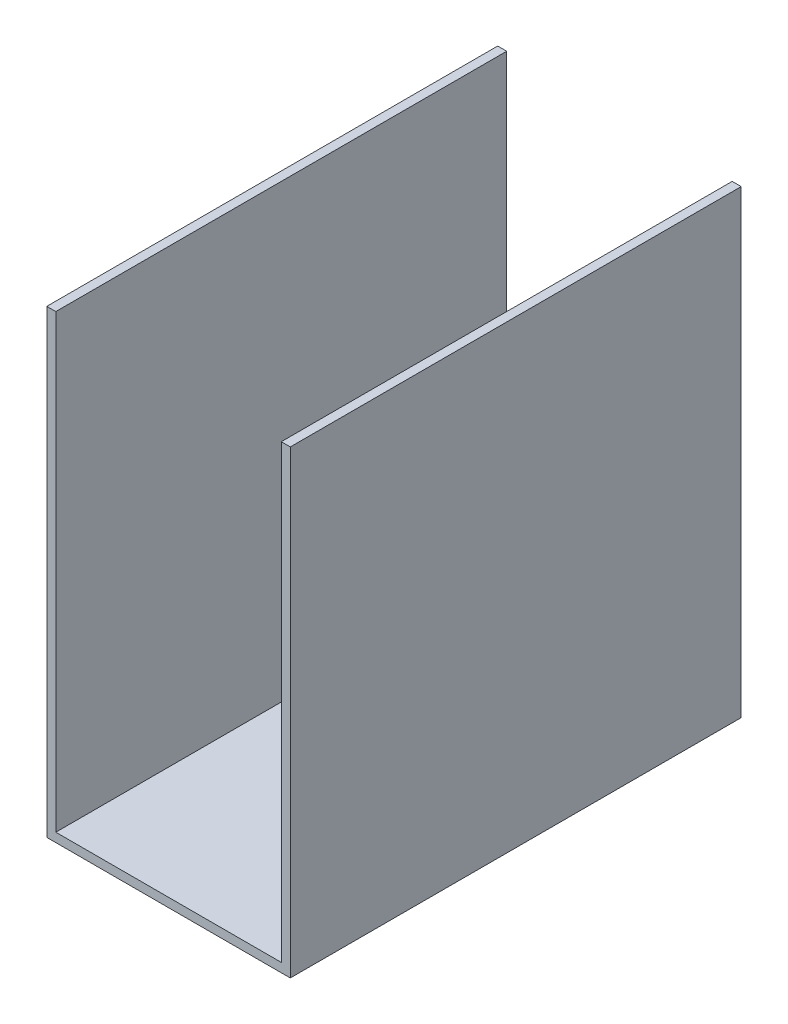
ISO-10303-21;
HEADER;
FILE_DESCRIPTION(('STEP AP214'),'2;1');
FILE_NAME('part.step','',(''),(''),'','','');
FILE_SCHEMA(('AUTOMOTIVE_DESIGN { 1 0 10303 214 1 1 1 1 }'));
ENDSEC;
DATA;
#1=APPLICATION_CONTEXT('core data for automotive mechanical design processes');
#2=APPLICATION_PROTOCOL_DEFINITION('international standard','automotive_design',2000,#1);
#3=PRODUCT_CONTEXT('',#1,'mechanical');
#4=PRODUCT('Part','Part','',(#3));
#5=PRODUCT_RELATED_PRODUCT_CATEGORY('part','',(#4));
#6=PRODUCT_DEFINITION_FORMATION('','',#4);
#7=PRODUCT_DEFINITION_CONTEXT('part definition',#1,'design');
#8=PRODUCT_DEFINITION('design','',#6,#7);
#9=PRODUCT_DEFINITION_SHAPE('','',#8);
#10=(LENGTH_UNIT() NAMED_UNIT(*) SI_UNIT(.MILLI.,.METRE.));
#11=(NAMED_UNIT(*) PLANE_ANGLE_UNIT() SI_UNIT($,.RADIAN.));
#12=(NAMED_UNIT(*) SI_UNIT($,.STERADIAN.) SOLID_ANGLE_UNIT());
#13=UNCERTAINTY_MEASURE_WITH_UNIT(LENGTH_MEASURE(1.E-05),#10,'distance_accuracy_value','');
#14=(GEOMETRIC_REPRESENTATION_CONTEXT(3) GLOBAL_UNCERTAINTY_ASSIGNED_CONTEXT((#13)) GLOBAL_UNIT_ASSIGNED_CONTEXT((#10,
#11,#12)) REPRESENTATION_CONTEXT('',''));
#15=CARTESIAN_POINT('',(0.,0.,0.));
#16=DIRECTION('',(0.,0.,1.));
#17=DIRECTION('',(1.,0.,0.));
#18=AXIS2_PLACEMENT_3D('',#15,#16,#17);
#19=CARTESIAN_POINT('',(-200.,0.,-10000.));
#20=DIRECTION('',(0.,1.,0.));
#21=DIRECTION('',(0.,0.,1.));
#22=AXIS2_PLACEMENT_3D('',#19,#20,#21);
#23=PLANE('',#22);
#24=DIRECTION('',(-1.,0.,0.));
#25=VECTOR('',#24,1.);
#26=CARTESIAN_POINT('',(-200.,0.,0.));
#27=LINE('',#26,#25);
#28=CARTESIAN_POINT('',(0.,0.,0.));
#29=VERTEX_POINT('',#28);
#30=CARTESIAN_POINT('',(-200.,0.,0.));
#31=VERTEX_POINT('',#30);
#32=EDGE_CURVE('E146',#29,#31,#27,.T.);
#33=ORIENTED_EDGE('',*,*,#32,.F.);
#34=DIRECTION('',(0.,0.,1.));
#35=VECTOR('',#34,1.);
#36=CARTESIAN_POINT('',(0.,0.,-10000.));
#37=LINE('',#36,#35);
#38=CARTESIAN_POINT('',(0.,0.,-10000.));
#39=VERTEX_POINT('',#38);
#40=EDGE_CURVE('E11',#39,#29,#37,.T.);
#41=ORIENTED_EDGE('',*,*,#40,.F.);
#42=DIRECTION('',(-1.,0.,0.));
#43=VECTOR('',#42,1.);
#44=CARTESIAN_POINT('',(-200.,0.,-10000.));
#45=LINE('',#44,#43);
#46=CARTESIAN_POINT('',(-200.,0.,-10000.));
#47=VERTEX_POINT('',#46);
#48=EDGE_CURVE('E174',#39,#47,#45,.T.);
#49=ORIENTED_EDGE('',*,*,#48,.T.);
#50=DIRECTION('',(0.,0.,1.));
#51=VECTOR('',#50,1.);
#52=CARTESIAN_POINT('',(-200.,0.,-10000.));
#53=LINE('',#52,#51);
#54=EDGE_CURVE('E46',#47,#31,#53,.T.);
#55=ORIENTED_EDGE('',*,*,#54,.T.);
#56=EDGE_LOOP('',(#33,#41,#49,#55));
#57=FACE_BOUND('',#56,.T.);
#58=ADVANCED_FACE('F43',(#57),#23,.T.);
#59=CARTESIAN_POINT('',(0.,0.,-10000.));
#60=DIRECTION('',(1.,0.,0.));
#61=DIRECTION('',(0.,1.,0.));
#62=AXIS2_PLACEMENT_3D('',#59,#60,#61);
#63=PLANE('',#62);
#64=DIRECTION('',(0.,1.,0.));
#65=VECTOR('',#64,1.);
#66=CARTESIAN_POINT('',(0.,0.,0.));
#67=LINE('',#66,#65);
#68=CARTESIAN_POINT('',(1.22464679914735E-12,-10000.,0.));
#69=VERTEX_POINT('',#68);
#70=EDGE_CURVE('E171',#69,#29,#67,.T.);
#71=ORIENTED_EDGE('',*,*,#70,.F.);
#72=DIRECTION('',(0.,0.,1.));
#73=VECTOR('',#72,1.);
#74=CARTESIAN_POINT('',(1.22464679914735E-12,-10000.,-10000.));
#75=LINE('',#74,#73);
#76=CARTESIAN_POINT('',(1.22464679914735E-12,-10000.,-10000.));
#77=VERTEX_POINT('',#76);
#78=EDGE_CURVE('E53',#77,#69,#75,.T.);
#79=ORIENTED_EDGE('',*,*,#78,.F.);
#80=DIRECTION('',(0.,1.,0.));
#81=VECTOR('',#80,1.);
#82=CARTESIAN_POINT('',(0.,0.,-10000.));
#83=LINE('',#82,#81);
#84=EDGE_CURVE('E132',#77,#39,#83,.T.);
#85=ORIENTED_EDGE('',*,*,#84,.T.);
#86=ORIENTED_EDGE('',*,*,#40,.T.);
#87=EDGE_LOOP('',(#71,#79,#85,#86));
#88=FACE_BOUND('',#87,.T.);
#89=ADVANCED_FACE('F192',(#88),#63,.T.);
#90=CARTESIAN_POINT('',(1.22464679914735E-12,-10000.,-10000.));
#91=DIRECTION('',(0.,1.,0.));
#92=DIRECTION('',(0.,0.,1.));
#93=AXIS2_PLACEMENT_3D('',#90,#91,#92);
#94=PLANE('',#93);
#95=DIRECTION('',(-1.,0.,0.));
#96=VECTOR('',#95,1.);
#97=CARTESIAN_POINT('',(1.22464679914735E-12,-10000.,0.));
#98=LINE('',#97,#96);
#99=CARTESIAN_POINT('',(5000.,-10000.,0.));
#100=VERTEX_POINT('',#99);
#101=EDGE_CURVE('E118',#100,#69,#98,.T.);
#102=ORIENTED_EDGE('',*,*,#101,.F.);
#103=DIRECTION('',(0.,0.,1.));
#104=VECTOR('',#103,1.);
#105=CARTESIAN_POINT('',(5000.,-10000.,-10000.));
#106=LINE('',#105,#104);
#107=CARTESIAN_POINT('',(5000.,-10000.,-10000.));
#108=VERTEX_POINT('',#107);
#109=EDGE_CURVE('E113',#108,#100,#106,.T.);
#110=ORIENTED_EDGE('',*,*,#109,.F.);
#111=DIRECTION('',(-1.,0.,0.));
#112=VECTOR('',#111,1.);
#113=CARTESIAN_POINT('',(1.22464679914735E-12,-10000.,-10000.));
#114=LINE('',#113,#112);
#115=EDGE_CURVE('E116',#108,#77,#114,.T.);
#116=ORIENTED_EDGE('',*,*,#115,.T.);
#117=ORIENTED_EDGE('',*,*,#78,.T.);
#118=EDGE_LOOP('',(#102,#110,#116,#117));
#119=FACE_BOUND('',#118,.T.);
#120=ADVANCED_FACE('F115',(#119),#94,.T.);
#121=CARTESIAN_POINT('',(5000.,-10000.,-10000.));
#122=DIRECTION('',(-1.,0.,0.));
#123=DIRECTION('',(0.,0.,1.));
#124=AXIS2_PLACEMENT_3D('',#121,#122,#123);
#125=PLANE('',#124);
#126=DIRECTION('',(0.,-1.,0.));
#127=VECTOR('',#126,1.);
#128=CARTESIAN_POINT('',(5000.,-10000.,0.));
#129=LINE('',#128,#127);
#130=CARTESIAN_POINT('',(5000.,0.,0.));
#131=VERTEX_POINT('',#130);
#132=EDGE_CURVE('E166',#131,#100,#129,.T.);
#133=ORIENTED_EDGE('',*,*,#132,.F.);
#134=DIRECTION('',(0.,0.,1.));
#135=VECTOR('',#134,1.);
#136=CARTESIAN_POINT('',(5000.,0.,-10000.));
#137=LINE('',#136,#135);
#138=CARTESIAN_POINT('',(5000.,0.,-10000.));
#139=VERTEX_POINT('',#138);
#140=EDGE_CURVE('E124',#139,#131,#137,.T.);
#141=ORIENTED_EDGE('',*,*,#140,.F.);
#142=DIRECTION('',(0.,-1.,0.));
#143=VECTOR('',#142,1.);
#144=CARTESIAN_POINT('',(5000.,-10000.,-10000.));
#145=LINE('',#144,#143);
#146=EDGE_CURVE('E130',#139,#108,#145,.T.);
#147=ORIENTED_EDGE('',*,*,#146,.T.);
#148=ORIENTED_EDGE('',*,*,#109,.T.);
#149=EDGE_LOOP('',(#133,#141,#147,#148));
#150=FACE_BOUND('',#149,.T.);
#151=ADVANCED_FACE('F135',(#150),#125,.T.);
#152=CARTESIAN_POINT('',(5000.,0.,-10000.));
#153=DIRECTION('',(0.,1.,0.));
#154=DIRECTION('',(0.,0.,1.));
#155=AXIS2_PLACEMENT_3D('',#152,#153,#154);
#156=PLANE('',#155);
#157=DIRECTION('',(-1.,0.,0.));
#158=VECTOR('',#157,1.);
#159=CARTESIAN_POINT('',(5000.,0.,0.));
#160=LINE('',#159,#158);
#161=CARTESIAN_POINT('',(5200.,0.,0.));
#162=VERTEX_POINT('',#161);
#163=EDGE_CURVE('E162',#162,#131,#160,.T.);
#164=ORIENTED_EDGE('',*,*,#163,.F.);
#165=DIRECTION('',(0.,0.,1.));
#166=VECTOR('',#165,1.);
#167=CARTESIAN_POINT('',(5200.,0.,-10000.));
#168=LINE('',#167,#166);
#169=CARTESIAN_POINT('',(5200.,0.,-10000.));
#170=VERTEX_POINT('',#169);
#171=EDGE_CURVE('E180',#170,#162,#168,.T.);
#172=ORIENTED_EDGE('',*,*,#171,.F.);
#173=DIRECTION('',(-1.,0.,0.));
#174=VECTOR('',#173,1.);
#175=CARTESIAN_POINT('',(5000.,0.,-10000.));
#176=LINE('',#175,#174);
#177=EDGE_CURVE('E137',#170,#139,#176,.T.);
#178=ORIENTED_EDGE('',*,*,#177,.T.);
#179=ORIENTED_EDGE('',*,*,#140,.T.);
#180=EDGE_LOOP('',(#164,#172,#178,#179));
#181=FACE_BOUND('',#180,.T.);
#182=ADVANCED_FACE('F205',(#181),#156,.T.);
#183=CARTESIAN_POINT('',(5200.,-10200.,-10000.));
#184=DIRECTION('',(1.,0.,0.));
#185=DIRECTION('',(0.,0.,-1.));
#186=AXIS2_PLACEMENT_3D('',#183,#184,#185);
#187=PLANE('',#186);
#188=DIRECTION('',(0.,1.,0.));
#189=VECTOR('',#188,1.);
#190=CARTESIAN_POINT('',(5200.,-10200.,0.));
#191=LINE('',#190,#189);
#192=CARTESIAN_POINT('',(5200.,-10200.,0.));
#193=VERTEX_POINT('',#192);
#194=EDGE_CURVE('E158',#193,#162,#191,.T.);
#195=ORIENTED_EDGE('',*,*,#194,.F.);
#196=DIRECTION('',(0.,0.,1.));
#197=VECTOR('',#196,1.);
#198=CARTESIAN_POINT('',(5200.,-10200.,-10000.));
#199=LINE('',#198,#197);
#200=CARTESIAN_POINT('',(5200.,-10200.,-10000.));
#201=VERTEX_POINT('',#200);
#202=EDGE_CURVE('E183',#201,#193,#199,.T.);
#203=ORIENTED_EDGE('',*,*,#202,.F.);
#204=DIRECTION('',(0.,1.,0.));
#205=VECTOR('',#204,1.);
#206=CARTESIAN_POINT('',(5200.,-10200.,-10000.));
#207=LINE('',#206,#205);
#208=EDGE_CURVE('E140',#201,#170,#207,.T.);
#209=ORIENTED_EDGE('',*,*,#208,.T.);
#210=ORIENTED_EDGE('',*,*,#171,.T.);
#211=EDGE_LOOP('',(#195,#203,#209,#210));
#212=FACE_BOUND('',#211,.T.);
#213=ADVANCED_FACE('F208',(#212),#187,.T.);
#214=CARTESIAN_POINT('',(-199.999999999998,-10200.,-10000.));
#215=DIRECTION('',(0.,-1.,0.));
#216=DIRECTION('',(0.,0.,-1.));
#217=AXIS2_PLACEMENT_3D('',#214,#215,#216);
#218=PLANE('',#217);
#219=DIRECTION('',(1.,0.,0.));
#220=VECTOR('',#219,1.);
#221=CARTESIAN_POINT('',(-199.999999999998,-10200.,0.));
#222=LINE('',#221,#220);
#223=CARTESIAN_POINT('',(-199.999999999998,-10200.,0.));
#224=VERTEX_POINT('',#223);
#225=EDGE_CURVE('E154',#224,#193,#222,.T.);
#226=ORIENTED_EDGE('',*,*,#225,.F.);
#227=DIRECTION('',(0.,0.,1.));
#228=VECTOR('',#227,1.);
#229=CARTESIAN_POINT('',(-199.999999999998,-10200.,-10000.));
#230=LINE('',#229,#228);
#231=CARTESIAN_POINT('',(-199.999999999998,-10200.,-10000.));
#232=VERTEX_POINT('',#231);
#233=EDGE_CURVE('E185',#232,#224,#230,.T.);
#234=ORIENTED_EDGE('',*,*,#233,.F.);
#235=DIRECTION('',(1.,0.,0.));
#236=VECTOR('',#235,1.);
#237=CARTESIAN_POINT('',(-199.999999999998,-10200.,-10000.));
#238=LINE('',#237,#236);
#239=EDGE_CURVE('E303',#232,#201,#238,.T.);
#240=ORIENTED_EDGE('',*,*,#239,.T.);
#241=ORIENTED_EDGE('',*,*,#202,.T.);
#242=EDGE_LOOP('',(#226,#234,#240,#241));
#243=FACE_BOUND('',#242,.T.);
#244=ADVANCED_FACE('F212',(#243),#218,.T.);
#245=CARTESIAN_POINT('',(-200.,0.,-10000.));
#246=DIRECTION('',(-1.,0.,0.));
#247=DIRECTION('',(0.,-1.,0.));
#248=AXIS2_PLACEMENT_3D('',#245,#246,#247);
#249=PLANE('',#248);
#250=DIRECTION('',(0.,-1.,0.));
#251=VECTOR('',#250,1.);
#252=CARTESIAN_POINT('',(-200.,0.,0.));
#253=LINE('',#252,#251);
#254=EDGE_CURVE('E150',#31,#224,#253,.T.);
#255=ORIENTED_EDGE('',*,*,#254,.F.);
#256=ORIENTED_EDGE('',*,*,#54,.F.);
#257=DIRECTION('',(0.,-1.,0.));
#258=VECTOR('',#257,1.);
#259=CARTESIAN_POINT('',(-200.,0.,-10000.));
#260=LINE('',#259,#258);
#261=EDGE_CURVE('E306',#47,#232,#260,.T.);
#262=ORIENTED_EDGE('',*,*,#261,.T.);
#263=ORIENTED_EDGE('',*,*,#233,.T.);
#264=EDGE_LOOP('',(#255,#256,#262,#263));
#265=FACE_BOUND('',#264,.T.);
#266=ADVANCED_FACE('F189',(#265),#249,.T.);
#267=CARTESIAN_POINT('',(0.,0.,-10000.));
#268=DIRECTION('',(0.,0.,-1.));
#269=DIRECTION('',(-1.,0.,0.));
#270=AXIS2_PLACEMENT_3D('',#267,#268,#269);
#271=PLANE('',#270);
#272=ORIENTED_EDGE('',*,*,#48,.F.);
#273=ORIENTED_EDGE('',*,*,#84,.F.);
#274=ORIENTED_EDGE('',*,*,#115,.F.);
#275=ORIENTED_EDGE('',*,*,#146,.F.);
#276=ORIENTED_EDGE('',*,*,#177,.F.);
#277=ORIENTED_EDGE('',*,*,#208,.F.);
#278=ORIENTED_EDGE('',*,*,#239,.F.);
#279=ORIENTED_EDGE('',*,*,#261,.F.);
#280=EDGE_LOOP('',(#272,#273,#274,#275,#276,#277,#278,#279));
#281=FACE_BOUND('',#280,.T.);
#282=ADVANCED_FACE('F128',(#281),#271,.T.);
#283=CARTESIAN_POINT('',(0.,0.,0.));
#284=DIRECTION('',(0.,0.,-1.));
#285=DIRECTION('',(-1.,0.,0.));
#286=AXIS2_PLACEMENT_3D('',#283,#284,#285);
#287=PLANE('',#286);
#288=ORIENTED_EDGE('',*,*,#32,.T.);
#289=ORIENTED_EDGE('',*,*,#254,.T.);
#290=ORIENTED_EDGE('',*,*,#225,.T.);
#291=ORIENTED_EDGE('',*,*,#194,.T.);
#292=ORIENTED_EDGE('',*,*,#163,.T.);
#293=ORIENTED_EDGE('',*,*,#132,.T.);
#294=ORIENTED_EDGE('',*,*,#101,.T.);
#295=ORIENTED_EDGE('',*,*,#70,.T.);
#296=EDGE_LOOP('',(#288,#289,#290,#291,#292,#293,#294,#295));
#297=FACE_BOUND('',#296,.T.);
#298=ADVANCED_FACE('F191',(#297),#287,.F.);
#299=CLOSED_SHELL('',(#58,#89,#120,#151,#182,#213,#244,#266,#282,#298));
#300=MANIFOLD_SOLID_BREP('B2',#299);
#301=ADVANCED_BREP_SHAPE_REPRESENTATION('',(#18,#300),#14);
#302=SHAPE_DEFINITION_REPRESENTATION(#9,#301);
ENDSEC;
END-ISO-10303-21;
